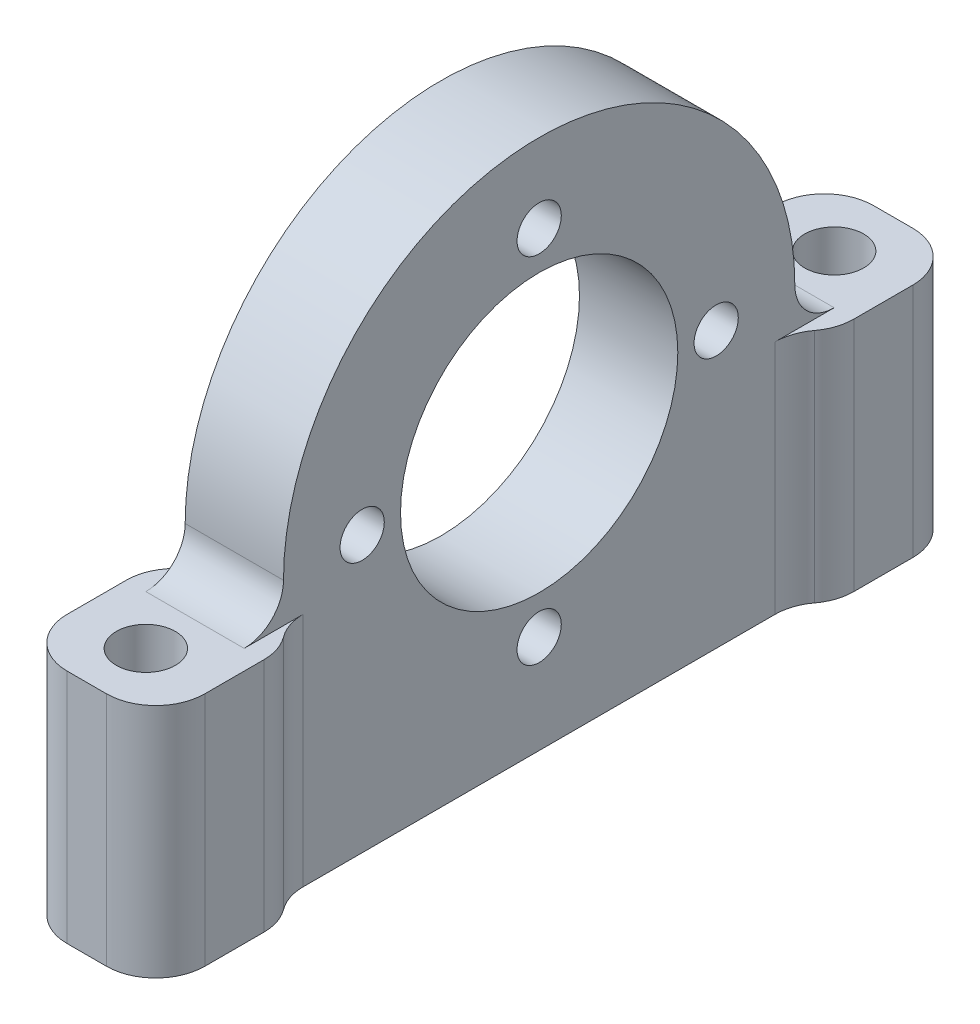
ISO-10303-21;
HEADER;
FILE_DESCRIPTION(('STEP AP214'),'2;1');
FILE_NAME('part.step','',(''),(''),'','','');
FILE_SCHEMA(('AUTOMOTIVE_DESIGN { 1 0 10303 214 1 1 1 1 }'));
ENDSEC;
DATA;
#1=APPLICATION_CONTEXT('core data for automotive mechanical design processes');
#2=APPLICATION_PROTOCOL_DEFINITION('international standard','automotive_design',2000,#1);
#3=PRODUCT_CONTEXT('',#1,'mechanical');
#4=PRODUCT('Part','Part','',(#3));
#5=PRODUCT_RELATED_PRODUCT_CATEGORY('part','',(#4));
#6=PRODUCT_DEFINITION_FORMATION('','',#4);
#7=PRODUCT_DEFINITION_CONTEXT('part definition',#1,'design');
#8=PRODUCT_DEFINITION('design','',#6,#7);
#9=PRODUCT_DEFINITION_SHAPE('','',#8);
#10=(LENGTH_UNIT() NAMED_UNIT(*) SI_UNIT(.MILLI.,.METRE.));
#11=(NAMED_UNIT(*) PLANE_ANGLE_UNIT() SI_UNIT($,.RADIAN.));
#12=(NAMED_UNIT(*) SI_UNIT($,.STERADIAN.) SOLID_ANGLE_UNIT());
#13=UNCERTAINTY_MEASURE_WITH_UNIT(LENGTH_MEASURE(1.E-05),#10,'distance_accuracy_value','');
#14=(GEOMETRIC_REPRESENTATION_CONTEXT(3) GLOBAL_UNCERTAINTY_ASSIGNED_CONTEXT((#13)) GLOBAL_UNIT_ASSIGNED_CONTEXT((#10,
#11,#12)) REPRESENTATION_CONTEXT('',''));
#15=CARTESIAN_POINT('',(0.,0.,0.));
#16=DIRECTION('',(0.,0.,1.));
#17=DIRECTION('',(1.,0.,0.));
#18=AXIS2_PLACEMENT_3D('',#15,#16,#17);
#19=CARTESIAN_POINT('',(-2.5,0.,0.));
#20=DIRECTION('',(1.,0.,0.));
#21=DIRECTION('',(0.,0.,-1.));
#22=AXIS2_PLACEMENT_3D('',#19,#20,#21);
#23=CYLINDRICAL_SURFACE('',#22,13.);
#24=DIRECTION('',(1.,0.,0.));
#25=VECTOR('',#24,1.);
#26=CARTESIAN_POINT('',(-2.5,0.,13.));
#27=LINE('',#26,#25);
#28=CARTESIAN_POINT('',(-2.5,0.,13.));
#29=VERTEX_POINT('',#28);
#30=CARTESIAN_POINT('',(2.5,0.,13.));
#31=VERTEX_POINT('',#30);
#32=EDGE_CURVE('E206',#29,#31,#27,.T.);
#33=ORIENTED_EDGE('',*,*,#32,.T.);
#34=CARTESIAN_POINT('',(2.5,0.,0.));
#35=DIRECTION('',(1.,0.,0.));
#36=DIRECTION('',(0.,0.,1.));
#37=AXIS2_PLACEMENT_3D('',#34,#35,#36);
#38=CIRCLE('',#37,13.);
#39=CARTESIAN_POINT('',(2.5,0.,-13.));
#40=VERTEX_POINT('',#39);
#41=EDGE_CURVE('E215',#40,#31,#38,.T.);
#42=ORIENTED_EDGE('',*,*,#41,.F.);
#43=DIRECTION('',(1.,0.,0.));
#44=VECTOR('',#43,1.);
#45=CARTESIAN_POINT('',(-2.5,0.,-13.));
#46=LINE('',#45,#44);
#47=CARTESIAN_POINT('',(-2.5,0.,-13.));
#48=VERTEX_POINT('',#47);
#49=EDGE_CURVE('E220',#48,#40,#46,.T.);
#50=ORIENTED_EDGE('',*,*,#49,.F.);
#51=CARTESIAN_POINT('',(-2.5,0.,0.));
#52=DIRECTION('',(1.,0.,0.));
#53=DIRECTION('',(0.,0.,1.));
#54=AXIS2_PLACEMENT_3D('',#51,#52,#53);
#55=CIRCLE('',#54,13.);
#56=EDGE_CURVE('E218',#48,#29,#55,.T.);
#57=ORIENTED_EDGE('',*,*,#56,.T.);
#58=EDGE_LOOP('',(#33,#42,#50,#57));
#59=FACE_BOUND('',#58,.T.);
#60=ADVANCED_FACE('F43',(#59),#23,.T.);
#61=CARTESIAN_POINT('',(-2.5,-14.,13.));
#62=DIRECTION('',(0.,-1.,0.));
#63=DIRECTION('',(0.,0.,-1.));
#64=AXIS2_PLACEMENT_3D('',#61,#62,#63);
#65=PLANE('',#64);
#66=CARTESIAN_POINT('',(0.,-14.,-17.5));
#67=DIRECTION('',(0.,-1.,0.));
#68=DIRECTION('',(0.,0.,-1.));
#69=AXIS2_PLACEMENT_3D('',#66,#67,#68);
#70=CIRCLE('',#69,1.5);
#71=CARTESIAN_POINT('',(0.,-14.,-19.));
#72=VERTEX_POINT('',#71);
#73=EDGE_CURVE('E440',#72,#72,#70,.T.);
#74=ORIENTED_EDGE('',*,*,#73,.F.);
#75=EDGE_LOOP('',(#74));
#76=FACE_BOUND('',#75,.T.);
#77=CARTESIAN_POINT('',(0.,-14.,17.5));
#78=DIRECTION('',(0.,1.,0.));
#79=DIRECTION('',(0.,0.,1.));
#80=AXIS2_PLACEMENT_3D('',#77,#78,#79);
#81=CIRCLE('',#80,1.5);
#82=CARTESIAN_POINT('',(0.,-14.,19.));
#83=VERTEX_POINT('',#82);
#84=EDGE_CURVE('E352',#83,#83,#81,.T.);
#85=ORIENTED_EDGE('',*,*,#84,.T.);
#86=EDGE_LOOP('',(#85));
#87=FACE_BOUND('',#86,.T.);
#88=DIRECTION('',(0.,0.,-1.));
#89=VECTOR('',#88,1.);
#90=CARTESIAN_POINT('',(-2.5,-14.,13.));
#91=LINE('',#90,#89);
#92=CARTESIAN_POINT('',(-2.5,-14.,12.));
#93=VERTEX_POINT('',#92);
#94=CARTESIAN_POINT('',(-2.5,-14.,-12.));
#95=VERTEX_POINT('',#94);
#96=EDGE_CURVE('E221',#93,#95,#91,.T.);
#97=ORIENTED_EDGE('',*,*,#96,.T.);
#98=CARTESIAN_POINT('',(-5.,-14.,-12.));
#99=DIRECTION('',(0.,-1.,0.));
#100=DIRECTION('',(0.,0.,-1.));
#101=AXIS2_PLACEMENT_3D('',#98,#99,#100);
#102=CIRCLE('',#101,2.5);
#103=CARTESIAN_POINT('',(-3.,-14.,-13.5));
#104=VERTEX_POINT('',#103);
#105=EDGE_CURVE('E425',#95,#104,#102,.F.);
#106=ORIENTED_EDGE('',*,*,#105,.T.);
#107=CARTESIAN_POINT('',(-1.,-14.,-15.));
#108=DIRECTION('',(0.,-1.,0.));
#109=DIRECTION('',(0.,0.,-1.));
#110=AXIS2_PLACEMENT_3D('',#107,#108,#109);
#111=CIRCLE('',#110,2.5);
#112=CARTESIAN_POINT('',(-3.5,-14.,-15.));
#113=VERTEX_POINT('',#112);
#114=EDGE_CURVE('E395',#104,#113,#111,.T.);
#115=ORIENTED_EDGE('',*,*,#114,.T.);
#116=DIRECTION('',(0.,0.,1.));
#117=VECTOR('',#116,1.);
#118=CARTESIAN_POINT('',(-3.5,-14.,-13.));
#119=LINE('',#118,#117);
#120=CARTESIAN_POINT('',(-3.5,-14.,-18.));
#121=VERTEX_POINT('',#120);
#122=EDGE_CURVE('E472',#121,#113,#119,.T.);
#123=ORIENTED_EDGE('',*,*,#122,.F.);
#124=CARTESIAN_POINT('',(-1.,-14.,-18.));
#125=DIRECTION('',(0.,-1.,0.));
#126=DIRECTION('',(0.,0.,-1.));
#127=AXIS2_PLACEMENT_3D('',#124,#125,#126);
#128=CIRCLE('',#127,2.5);
#129=CARTESIAN_POINT('',(-1.,-14.,-20.5));
#130=VERTEX_POINT('',#129);
#131=EDGE_CURVE('E359',#121,#130,#128,.T.);
#132=ORIENTED_EDGE('',*,*,#131,.T.);
#133=DIRECTION('',(1.,0.,0.));
#134=VECTOR('',#133,1.);
#135=CARTESIAN_POINT('',(-3.5,-14.,-20.5));
#136=LINE('',#135,#134);
#137=CARTESIAN_POINT('',(1.,-14.,-20.5));
#138=VERTEX_POINT('',#137);
#139=EDGE_CURVE('E482',#130,#138,#136,.T.);
#140=ORIENTED_EDGE('',*,*,#139,.T.);
#141=CARTESIAN_POINT('',(1.,-14.,-18.));
#142=DIRECTION('',(0.,-1.,0.));
#143=DIRECTION('',(0.,0.,-1.));
#144=AXIS2_PLACEMENT_3D('',#141,#142,#143);
#145=CIRCLE('',#144,2.5);
#146=CARTESIAN_POINT('',(3.5,-14.,-18.));
#147=VERTEX_POINT('',#146);
#148=EDGE_CURVE('E356',#138,#147,#145,.T.);
#149=ORIENTED_EDGE('',*,*,#148,.T.);
#150=DIRECTION('',(0.,0.,1.));
#151=VECTOR('',#150,1.);
#152=CARTESIAN_POINT('',(3.5,-14.,-13.));
#153=LINE('',#152,#151);
#154=CARTESIAN_POINT('',(3.5,-14.,-15.));
#155=VERTEX_POINT('',#154);
#156=EDGE_CURVE('E439',#147,#155,#153,.T.);
#157=ORIENTED_EDGE('',*,*,#156,.T.);
#158=CARTESIAN_POINT('',(1.,-14.,-15.));
#159=DIRECTION('',(0.,-1.,0.));
#160=DIRECTION('',(0.,0.,-1.));
#161=AXIS2_PLACEMENT_3D('',#158,#159,#160);
#162=CIRCLE('',#161,2.5);
#163=CARTESIAN_POINT('',(3.,-14.,-13.5));
#164=VERTEX_POINT('',#163);
#165=EDGE_CURVE('E391',#155,#164,#162,.T.);
#166=ORIENTED_EDGE('',*,*,#165,.T.);
#167=CARTESIAN_POINT('',(5.,-14.,-12.));
#168=DIRECTION('',(0.,-1.,0.));
#169=DIRECTION('',(0.,0.,-1.));
#170=AXIS2_PLACEMENT_3D('',#167,#168,#169);
#171=CIRCLE('',#170,2.5);
#172=CARTESIAN_POINT('',(2.5,-14.,-12.));
#173=VERTEX_POINT('',#172);
#174=EDGE_CURVE('E431',#164,#173,#171,.F.);
#175=ORIENTED_EDGE('',*,*,#174,.T.);
#176=DIRECTION('',(0.,0.,-1.));
#177=VECTOR('',#176,1.);
#178=CARTESIAN_POINT('',(2.5,-14.,13.));
#179=LINE('',#178,#177);
#180=CARTESIAN_POINT('',(2.5,-14.,12.));
#181=VERTEX_POINT('',#180);
#182=EDGE_CURVE('E229',#181,#173,#179,.T.);
#183=ORIENTED_EDGE('',*,*,#182,.F.);
#184=CARTESIAN_POINT('',(5.,-14.,12.));
#185=DIRECTION('',(0.,-1.,0.));
#186=DIRECTION('',(0.,0.,-1.));
#187=AXIS2_PLACEMENT_3D('',#184,#185,#186);
#188=CIRCLE('',#187,2.5);
#189=CARTESIAN_POINT('',(3.,-14.,13.5));
#190=VERTEX_POINT('',#189);
#191=EDGE_CURVE('E340',#181,#190,#188,.F.);
#192=ORIENTED_EDGE('',*,*,#191,.T.);
#193=CARTESIAN_POINT('',(1.,-14.,15.));
#194=DIRECTION('',(0.,-1.,0.));
#195=DIRECTION('',(0.,0.,-1.));
#196=AXIS2_PLACEMENT_3D('',#193,#194,#195);
#197=CIRCLE('',#196,2.5);
#198=CARTESIAN_POINT('',(3.5,-14.,15.));
#199=VERTEX_POINT('',#198);
#200=EDGE_CURVE('E305',#190,#199,#197,.T.);
#201=ORIENTED_EDGE('',*,*,#200,.T.);
#202=DIRECTION('',(0.,0.,-1.));
#203=VECTOR('',#202,1.);
#204=CARTESIAN_POINT('',(3.5,-14.,13.));
#205=LINE('',#204,#203);
#206=CARTESIAN_POINT('',(3.5,-14.,18.));
#207=VERTEX_POINT('',#206);
#208=EDGE_CURVE('E499',#207,#199,#205,.T.);
#209=ORIENTED_EDGE('',*,*,#208,.F.);
#210=CARTESIAN_POINT('',(1.,-14.,18.));
#211=DIRECTION('',(0.,-1.,0.));
#212=DIRECTION('',(0.,0.,-1.));
#213=AXIS2_PLACEMENT_3D('',#210,#211,#212);
#214=CIRCLE('',#213,2.5);
#215=CARTESIAN_POINT('',(1.,-14.,20.5));
#216=VERTEX_POINT('',#215);
#217=EDGE_CURVE('E274',#207,#216,#214,.T.);
#218=ORIENTED_EDGE('',*,*,#217,.T.);
#219=DIRECTION('',(1.,0.,0.));
#220=VECTOR('',#219,1.);
#221=CARTESIAN_POINT('',(-3.5,-14.,20.5));
#222=LINE('',#221,#220);
#223=CARTESIAN_POINT('',(-1.,-14.,20.5));
#224=VERTEX_POINT('',#223);
#225=EDGE_CURVE('E511',#224,#216,#222,.T.);
#226=ORIENTED_EDGE('',*,*,#225,.F.);
#227=CARTESIAN_POINT('',(-1.,-14.,18.));
#228=DIRECTION('',(0.,-1.,0.));
#229=DIRECTION('',(0.,0.,-1.));
#230=AXIS2_PLACEMENT_3D('',#227,#228,#229);
#231=CIRCLE('',#230,2.5);
#232=CARTESIAN_POINT('',(-3.5,-14.,18.));
#233=VERTEX_POINT('',#232);
#234=EDGE_CURVE('E277',#224,#233,#231,.T.);
#235=ORIENTED_EDGE('',*,*,#234,.T.);
#236=DIRECTION('',(0.,0.,-1.));
#237=VECTOR('',#236,1.);
#238=CARTESIAN_POINT('',(-3.5,-14.,13.));
#239=LINE('',#238,#237);
#240=CARTESIAN_POINT('',(-3.5,-14.,15.));
#241=VERTEX_POINT('',#240);
#242=EDGE_CURVE('E506',#233,#241,#239,.T.);
#243=ORIENTED_EDGE('',*,*,#242,.T.);
#244=CARTESIAN_POINT('',(-1.,-14.,15.));
#245=DIRECTION('',(0.,-1.,0.));
#246=DIRECTION('',(0.,0.,-1.));
#247=AXIS2_PLACEMENT_3D('',#244,#245,#246);
#248=CIRCLE('',#247,2.5);
#249=CARTESIAN_POINT('',(-3.,-14.,13.5));
#250=VERTEX_POINT('',#249);
#251=EDGE_CURVE('E308',#241,#250,#248,.T.);
#252=ORIENTED_EDGE('',*,*,#251,.T.);
#253=CARTESIAN_POINT('',(-5.,-14.,12.));
#254=DIRECTION('',(0.,-1.,0.));
#255=DIRECTION('',(0.,0.,-1.));
#256=AXIS2_PLACEMENT_3D('',#253,#254,#255);
#257=CIRCLE('',#256,2.5);
#258=EDGE_CURVE('E334',#250,#93,#257,.F.);
#259=ORIENTED_EDGE('',*,*,#258,.T.);
#260=EDGE_LOOP('',(#97,#106,#115,#123,#132,#140,#149,#157,#166,#175,#183,#192,#201,#209,#218,
#226,#235,#243,#252,#259));
#261=FACE_BOUND('',#260,.T.);
#262=ADVANCED_FACE('F471',(#76,#87,#261),#65,.T.);
#263=CARTESIAN_POINT('',(-2.5,0.,0.));
#264=DIRECTION('',(-1.,0.,0.));
#265=DIRECTION('',(0.,0.,1.));
#266=AXIS2_PLACEMENT_3D('',#263,#264,#265);
#267=PLANE('',#266);
#268=CARTESIAN_POINT('',(-2.5,0.,0.));
#269=DIRECTION('',(1.,0.,0.));
#270=DIRECTION('',(0.,0.,-1.));
#271=AXIS2_PLACEMENT_3D('',#268,#269,#270);
#272=CIRCLE('',#271,7.05);
#273=CARTESIAN_POINT('',(-2.5,0.,-7.05));
#274=VERTEX_POINT('',#273);
#275=EDGE_CURVE('E234',#274,#274,#272,.T.);
#276=ORIENTED_EDGE('',*,*,#275,.T.);
#277=EDGE_LOOP('',(#276));
#278=FACE_BOUND('',#277,.T.);
#279=CARTESIAN_POINT('',(-2.5,0.,9.));
#280=DIRECTION('',(1.,0.,0.));
#281=DIRECTION('',(0.,0.,-1.));
#282=AXIS2_PLACEMENT_3D('',#279,#280,#281);
#283=CIRCLE('',#282,1.125);
#284=CARTESIAN_POINT('',(-2.5,0.,7.875));
#285=VERTEX_POINT('',#284);
#286=EDGE_CURVE('E244',#285,#285,#283,.T.);
#287=ORIENTED_EDGE('',*,*,#286,.T.);
#288=EDGE_LOOP('',(#287));
#289=FACE_BOUND('',#288,.T.);
#290=CARTESIAN_POINT('',(-2.5,-9.,0.));
#291=DIRECTION('',(1.,0.,0.));
#292=DIRECTION('',(0.,0.,-1.));
#293=AXIS2_PLACEMENT_3D('',#290,#291,#292);
#294=CIRCLE('',#293,1.125);
#295=CARTESIAN_POINT('',(-2.5,-9.,-1.125));
#296=VERTEX_POINT('',#295);
#297=EDGE_CURVE('E248',#296,#296,#294,.T.);
#298=ORIENTED_EDGE('',*,*,#297,.T.);
#299=EDGE_LOOP('',(#298));
#300=FACE_BOUND('',#299,.T.);
#301=CARTESIAN_POINT('',(-2.5,0.,-9.));
#302=DIRECTION('',(1.,0.,0.));
#303=DIRECTION('',(0.,0.,-1.));
#304=AXIS2_PLACEMENT_3D('',#301,#302,#303);
#305=CIRCLE('',#304,1.125);
#306=CARTESIAN_POINT('',(-2.5,0.,-10.125));
#307=VERTEX_POINT('',#306);
#308=EDGE_CURVE('E252',#307,#307,#305,.T.);
#309=ORIENTED_EDGE('',*,*,#308,.T.);
#310=EDGE_LOOP('',(#309));
#311=FACE_BOUND('',#310,.T.);
#312=CARTESIAN_POINT('',(-2.5,9.,0.));
#313=DIRECTION('',(1.,0.,0.));
#314=DIRECTION('',(0.,0.,-1.));
#315=AXIS2_PLACEMENT_3D('',#312,#313,#314);
#316=CIRCLE('',#315,1.125);
#317=CARTESIAN_POINT('',(-2.5,9.,-1.125));
#318=VERTEX_POINT('',#317);
#319=EDGE_CURVE('E256',#318,#318,#316,.T.);
#320=ORIENTED_EDGE('',*,*,#319,.T.);
#321=EDGE_LOOP('',(#320));
#322=FACE_BOUND('',#321,.T.);
#323=ORIENTED_EDGE('',*,*,#56,.F.);
#324=CARTESIAN_POINT('',(-2.5,0.,-15.));
#325=DIRECTION('',(-1.,0.,0.));
#326=DIRECTION('',(0.,0.,1.));
#327=AXIS2_PLACEMENT_3D('',#324,#325,#326);
#328=CIRCLE('',#327,2.);
#329=CARTESIAN_POINT('',(-2.5,-2.,-15.));
#330=VERTEX_POINT('',#329);
#331=EDGE_CURVE('E211',#48,#330,#328,.F.);
#332=ORIENTED_EDGE('',*,*,#331,.T.);
#333=DIRECTION('',(0.,0.,1.));
#334=VECTOR('',#333,1.);
#335=CARTESIAN_POINT('',(-2.5,-2.,0.));
#336=LINE('',#335,#334);
#337=CARTESIAN_POINT('',(-2.5,-2.,-12.));
#338=VERTEX_POINT('',#337);
#339=EDGE_CURVE('E408',#330,#338,#336,.T.);
#340=ORIENTED_EDGE('',*,*,#339,.T.);
#341=DIRECTION('',(0.,-1.,0.));
#342=VECTOR('',#341,1.);
#343=CARTESIAN_POINT('',(-2.5,-14.,-12.));
#344=LINE('',#343,#342);
#345=EDGE_CURVE('E405',#338,#95,#344,.T.);
#346=ORIENTED_EDGE('',*,*,#345,.T.);
#347=ORIENTED_EDGE('',*,*,#96,.F.);
#348=DIRECTION('',(0.,-1.,0.));
#349=VECTOR('',#348,1.);
#350=CARTESIAN_POINT('',(-2.5,-2.,12.));
#351=LINE('',#350,#349);
#352=CARTESIAN_POINT('',(-2.5,-2.,12.));
#353=VERTEX_POINT('',#352);
#354=EDGE_CURVE('E322',#93,#353,#351,.F.);
#355=ORIENTED_EDGE('',*,*,#354,.T.);
#356=DIRECTION('',(0.,0.,1.));
#357=VECTOR('',#356,1.);
#358=CARTESIAN_POINT('',(-2.5,-2.,13.));
#359=LINE('',#358,#357);
#360=CARTESIAN_POINT('',(-2.5,-2.,15.));
#361=VERTEX_POINT('',#360);
#362=EDGE_CURVE('E66',#353,#361,#359,.T.);
#363=ORIENTED_EDGE('',*,*,#362,.T.);
#364=CARTESIAN_POINT('',(-2.5,0.,15.));
#365=DIRECTION('',(-1.,0.,0.));
#366=DIRECTION('',(0.,0.,1.));
#367=AXIS2_PLACEMENT_3D('',#364,#365,#366);
#368=CIRCLE('',#367,2.);
#369=EDGE_CURVE('E11',#361,#29,#368,.F.);
#370=ORIENTED_EDGE('',*,*,#369,.T.);
#371=EDGE_LOOP('',(#323,#332,#340,#346,#347,#355,#363,#370));
#372=FACE_BOUND('',#371,.T.);
#373=ADVANCED_FACE('F452',(#278,#289,#300,#311,#322,#372),#267,.T.);
#374=CARTESIAN_POINT('',(-2.5,9.,0.));
#375=DIRECTION('',(1.,0.,0.));
#376=DIRECTION('',(0.,0.,-1.));
#377=AXIS2_PLACEMENT_3D('',#374,#375,#376);
#378=CYLINDRICAL_SURFACE('',#377,1.125);
#379=ORIENTED_EDGE('',*,*,#319,.F.);
#380=EDGE_LOOP('',(#379));
#381=FACE_BOUND('',#380,.T.);
#382=CARTESIAN_POINT('',(2.5,9.,0.));
#383=DIRECTION('',(1.,0.,0.));
#384=DIRECTION('',(0.,0.,-1.));
#385=AXIS2_PLACEMENT_3D('',#382,#383,#384);
#386=CIRCLE('',#385,1.125);
#387=CARTESIAN_POINT('',(2.5,9.,-1.125));
#388=VERTEX_POINT('',#387);
#389=EDGE_CURVE('E230',#388,#388,#386,.T.);
#390=ORIENTED_EDGE('',*,*,#389,.T.);
#391=EDGE_LOOP('',(#390));
#392=FACE_BOUND('',#391,.T.);
#393=ADVANCED_FACE('F760',(#381,#392),#378,.F.);
#394=CARTESIAN_POINT('',(-2.5,0.,-9.));
#395=DIRECTION('',(1.,0.,0.));
#396=DIRECTION('',(0.,0.,-1.));
#397=AXIS2_PLACEMENT_3D('',#394,#395,#396);
#398=CYLINDRICAL_SURFACE('',#397,1.125);
#399=ORIENTED_EDGE('',*,*,#308,.F.);
#400=EDGE_LOOP('',(#399));
#401=FACE_BOUND('',#400,.T.);
#402=CARTESIAN_POINT('',(2.5,0.,-9.));
#403=DIRECTION('',(1.,0.,0.));
#404=DIRECTION('',(0.,0.,-1.));
#405=AXIS2_PLACEMENT_3D('',#402,#403,#404);
#406=CIRCLE('',#405,1.125);
#407=CARTESIAN_POINT('',(2.5,0.,-10.125));
#408=VERTEX_POINT('',#407);
#409=EDGE_CURVE('E237',#408,#408,#406,.T.);
#410=ORIENTED_EDGE('',*,*,#409,.T.);
#411=EDGE_LOOP('',(#410));
#412=FACE_BOUND('',#411,.T.);
#413=ADVANCED_FACE('F533',(#401,#412),#398,.F.);
#414=CARTESIAN_POINT('',(-2.5,-9.,0.));
#415=DIRECTION('',(1.,0.,0.));
#416=DIRECTION('',(0.,0.,-1.));
#417=AXIS2_PLACEMENT_3D('',#414,#415,#416);
#418=CYLINDRICAL_SURFACE('',#417,1.125);
#419=ORIENTED_EDGE('',*,*,#297,.F.);
#420=EDGE_LOOP('',(#419));
#421=FACE_BOUND('',#420,.T.);
#422=CARTESIAN_POINT('',(2.5,-9.,0.));
#423=DIRECTION('',(1.,0.,0.));
#424=DIRECTION('',(0.,0.,-1.));
#425=AXIS2_PLACEMENT_3D('',#422,#423,#424);
#426=CIRCLE('',#425,1.125);
#427=CARTESIAN_POINT('',(2.5,-9.,-1.125));
#428=VERTEX_POINT('',#427);
#429=EDGE_CURVE('E526',#428,#428,#426,.T.);
#430=ORIENTED_EDGE('',*,*,#429,.T.);
#431=EDGE_LOOP('',(#430));
#432=FACE_BOUND('',#431,.T.);
#433=ADVANCED_FACE('F553',(#421,#432),#418,.F.);
#434=CARTESIAN_POINT('',(-2.5,0.,9.));
#435=DIRECTION('',(1.,0.,0.));
#436=DIRECTION('',(0.,0.,-1.));
#437=AXIS2_PLACEMENT_3D('',#434,#435,#436);
#438=CYLINDRICAL_SURFACE('',#437,1.125);
#439=ORIENTED_EDGE('',*,*,#286,.F.);
#440=EDGE_LOOP('',(#439));
#441=FACE_BOUND('',#440,.T.);
#442=CARTESIAN_POINT('',(2.5,0.,9.));
#443=DIRECTION('',(1.,0.,0.));
#444=DIRECTION('',(0.,0.,-1.));
#445=AXIS2_PLACEMENT_3D('',#442,#443,#444);
#446=CIRCLE('',#445,1.125);
#447=CARTESIAN_POINT('',(2.5,0.,7.875));
#448=VERTEX_POINT('',#447);
#449=EDGE_CURVE('E522',#448,#448,#446,.T.);
#450=ORIENTED_EDGE('',*,*,#449,.T.);
#451=EDGE_LOOP('',(#450));
#452=FACE_BOUND('',#451,.T.);
#453=ADVANCED_FACE('F547',(#441,#452),#438,.F.);
#454=CARTESIAN_POINT('',(-2.5,0.,0.));
#455=DIRECTION('',(1.,0.,0.));
#456=DIRECTION('',(0.,0.,-1.));
#457=AXIS2_PLACEMENT_3D('',#454,#455,#456);
#458=CYLINDRICAL_SURFACE('',#457,7.05);
#459=ORIENTED_EDGE('',*,*,#275,.F.);
#460=EDGE_LOOP('',(#459));
#461=FACE_BOUND('',#460,.T.);
#462=CARTESIAN_POINT('',(2.5,0.,0.));
#463=DIRECTION('',(1.,0.,0.));
#464=DIRECTION('',(0.,0.,-1.));
#465=AXIS2_PLACEMENT_3D('',#462,#463,#464);
#466=CIRCLE('',#465,7.05);
#467=CARTESIAN_POINT('',(2.5,0.,-7.05));
#468=VERTEX_POINT('',#467);
#469=EDGE_CURVE('E515',#468,#468,#466,.T.);
#470=ORIENTED_EDGE('',*,*,#469,.T.);
#471=EDGE_LOOP('',(#470));
#472=FACE_BOUND('',#471,.T.);
#473=ADVANCED_FACE('F538',(#461,#472),#458,.F.);
#474=CARTESIAN_POINT('',(2.5,0.,0.));
#475=DIRECTION('',(-1.,0.,0.));
#476=DIRECTION('',(0.,0.,1.));
#477=AXIS2_PLACEMENT_3D('',#474,#475,#476);
#478=PLANE('',#477);
#479=ORIENTED_EDGE('',*,*,#182,.T.);
#480=DIRECTION('',(0.,1.,0.));
#481=VECTOR('',#480,1.);
#482=CARTESIAN_POINT('',(2.5,0.,-12.));
#483=LINE('',#482,#481);
#484=CARTESIAN_POINT('',(2.5,-2.,-12.));
#485=VERTEX_POINT('',#484);
#486=EDGE_CURVE('E415',#173,#485,#483,.T.);
#487=ORIENTED_EDGE('',*,*,#486,.T.);
#488=DIRECTION('',(0.,0.,-1.));
#489=VECTOR('',#488,1.);
#490=CARTESIAN_POINT('',(2.5,-2.,-13.));
#491=LINE('',#490,#489);
#492=CARTESIAN_POINT('',(2.5,-2.,-15.));
#493=VERTEX_POINT('',#492);
#494=EDGE_CURVE('E412',#485,#493,#491,.T.);
#495=ORIENTED_EDGE('',*,*,#494,.T.);
#496=CARTESIAN_POINT('',(2.5,0.,-15.));
#497=DIRECTION('',(-1.,0.,0.));
#498=DIRECTION('',(0.,0.,1.));
#499=AXIS2_PLACEMENT_3D('',#496,#497,#498);
#500=CIRCLE('',#499,2.);
#501=EDGE_CURVE('E227',#493,#40,#500,.T.);
#502=ORIENTED_EDGE('',*,*,#501,.T.);
#503=ORIENTED_EDGE('',*,*,#41,.T.);
#504=CARTESIAN_POINT('',(2.5,0.,15.));
#505=DIRECTION('',(-1.,0.,0.));
#506=DIRECTION('',(0.,0.,1.));
#507=AXIS2_PLACEMENT_3D('',#504,#505,#506);
#508=CIRCLE('',#507,2.);
#509=CARTESIAN_POINT('',(2.5,-2.,15.));
#510=VERTEX_POINT('',#509);
#511=EDGE_CURVE('E52',#31,#510,#508,.T.);
#512=ORIENTED_EDGE('',*,*,#511,.T.);
#513=DIRECTION('',(0.,0.,-1.));
#514=VECTOR('',#513,1.);
#515=CARTESIAN_POINT('',(2.5,-2.,0.));
#516=LINE('',#515,#514);
#517=CARTESIAN_POINT('',(2.5,-2.,12.));
#518=VERTEX_POINT('',#517);
#519=EDGE_CURVE('E59',#510,#518,#516,.T.);
#520=ORIENTED_EDGE('',*,*,#519,.T.);
#521=DIRECTION('',(0.,1.,0.));
#522=VECTOR('',#521,1.);
#523=CARTESIAN_POINT('',(2.5,0.,12.));
#524=LINE('',#523,#522);
#525=EDGE_CURVE('E327',#518,#181,#524,.F.);
#526=ORIENTED_EDGE('',*,*,#525,.T.);
#527=EDGE_LOOP('',(#479,#487,#495,#502,#503,#512,#520,#526));
#528=FACE_BOUND('',#527,.T.);
#529=ORIENTED_EDGE('',*,*,#389,.F.);
#530=EDGE_LOOP('',(#529));
#531=FACE_BOUND('',#530,.T.);
#532=ORIENTED_EDGE('',*,*,#409,.F.);
#533=EDGE_LOOP('',(#532));
#534=FACE_BOUND('',#533,.T.);
#535=ORIENTED_EDGE('',*,*,#429,.F.);
#536=EDGE_LOOP('',(#535));
#537=FACE_BOUND('',#536,.T.);
#538=ORIENTED_EDGE('',*,*,#449,.F.);
#539=EDGE_LOOP('',(#538));
#540=FACE_BOUND('',#539,.T.);
#541=ORIENTED_EDGE('',*,*,#469,.F.);
#542=EDGE_LOOP('',(#541));
#543=FACE_BOUND('',#542,.T.);
#544=ADVANCED_FACE('F224',(#528,#531,#534,#537,#540,#543),#478,.F.);
#545=CARTESIAN_POINT('',(-3.5,-14.,20.5));
#546=DIRECTION('',(0.,0.,1.));
#547=DIRECTION('',(1.,0.,0.));
#548=AXIS2_PLACEMENT_3D('',#545,#546,#547);
#549=PLANE('',#548);
#550=DIRECTION('',(1.,0.,0.));
#551=VECTOR('',#550,1.);
#552=CARTESIAN_POINT('',(-3.5,-2.,20.5));
#553=LINE('',#552,#551);
#554=CARTESIAN_POINT('',(-1.,-2.,20.5));
#555=VERTEX_POINT('',#554);
#556=CARTESIAN_POINT('',(1.,-2.,20.5));
#557=VERTEX_POINT('',#556);
#558=EDGE_CURVE('E510',#555,#557,#553,.T.);
#559=ORIENTED_EDGE('',*,*,#558,.F.);
#560=DIRECTION('',(0.,-1.,0.));
#561=VECTOR('',#560,1.);
#562=CARTESIAN_POINT('',(-1.,-14.,20.5));
#563=LINE('',#562,#561);
#564=EDGE_CURVE('E270',#555,#224,#563,.T.);
#565=ORIENTED_EDGE('',*,*,#564,.T.);
#566=ORIENTED_EDGE('',*,*,#225,.T.);
#567=DIRECTION('',(0.,-1.,0.));
#568=VECTOR('',#567,1.);
#569=CARTESIAN_POINT('',(1.,-14.,20.5));
#570=LINE('',#569,#568);
#571=EDGE_CURVE('E266',#216,#557,#570,.F.);
#572=ORIENTED_EDGE('',*,*,#571,.T.);
#573=EDGE_LOOP('',(#559,#565,#566,#572));
#574=FACE_BOUND('',#573,.T.);
#575=ADVANCED_FACE('F537',(#574),#549,.T.);
#576=CARTESIAN_POINT('',(-3.5,-2.,13.));
#577=DIRECTION('',(0.,1.,0.));
#578=DIRECTION('',(0.,0.,1.));
#579=AXIS2_PLACEMENT_3D('',#576,#577,#578);
#580=PLANE('',#579);
#581=CARTESIAN_POINT('',(0.,-2.,17.5));
#582=DIRECTION('',(0.,1.,0.));
#583=DIRECTION('',(0.,0.,1.));
#584=AXIS2_PLACEMENT_3D('',#581,#582,#583);
#585=CIRCLE('',#584,1.5);
#586=CARTESIAN_POINT('',(0.,-2.,19.));
#587=VERTEX_POINT('',#586);
#588=EDGE_CURVE('E347',#587,#587,#585,.T.);
#589=ORIENTED_EDGE('',*,*,#588,.F.);
#590=EDGE_LOOP('',(#589));
#591=FACE_BOUND('',#590,.T.);
#592=ORIENTED_EDGE('',*,*,#519,.F.);
#593=DIRECTION('',(1.,0.,0.));
#594=VECTOR('',#593,1.);
#595=CARTESIAN_POINT('',(-2.5,-2.,15.));
#596=LINE('',#595,#594);
#597=EDGE_CURVE('E207',#510,#361,#596,.F.);
#598=ORIENTED_EDGE('',*,*,#597,.T.);
#599=ORIENTED_EDGE('',*,*,#362,.F.);
#600=CARTESIAN_POINT('',(-5.,-2.,12.));
#601=DIRECTION('',(0.,1.,0.));
#602=DIRECTION('',(0.,0.,1.));
#603=AXIS2_PLACEMENT_3D('',#600,#601,#602);
#604=CIRCLE('',#603,2.5);
#605=CARTESIAN_POINT('',(-3.,-2.,13.5));
#606=VERTEX_POINT('',#605);
#607=EDGE_CURVE('E337',#353,#606,#604,.F.);
#608=ORIENTED_EDGE('',*,*,#607,.T.);
#609=CARTESIAN_POINT('',(-1.,-2.,15.));
#610=DIRECTION('',(0.,1.,0.));
#611=DIRECTION('',(0.,0.,1.));
#612=AXIS2_PLACEMENT_3D('',#609,#610,#611);
#613=CIRCLE('',#612,2.5);
#614=CARTESIAN_POINT('',(-3.5,-2.,15.));
#615=VERTEX_POINT('',#614);
#616=EDGE_CURVE('E299',#606,#615,#613,.T.);
#617=ORIENTED_EDGE('',*,*,#616,.T.);
#618=DIRECTION('',(0.,0.,1.));
#619=VECTOR('',#618,1.);
#620=CARTESIAN_POINT('',(-3.5,-2.,13.));
#621=LINE('',#620,#619);
#622=CARTESIAN_POINT('',(-3.5,-2.,18.));
#623=VERTEX_POINT('',#622);
#624=EDGE_CURVE('E503',#615,#623,#621,.T.);
#625=ORIENTED_EDGE('',*,*,#624,.T.);
#626=CARTESIAN_POINT('',(-1.,-2.,18.));
#627=DIRECTION('',(0.,1.,0.));
#628=DIRECTION('',(0.,0.,1.));
#629=AXIS2_PLACEMENT_3D('',#626,#627,#628);
#630=CIRCLE('',#629,2.5);
#631=EDGE_CURVE('E288',#623,#555,#630,.T.);
#632=ORIENTED_EDGE('',*,*,#631,.T.);
#633=ORIENTED_EDGE('',*,*,#558,.T.);
#634=CARTESIAN_POINT('',(1.,-2.,18.));
#635=DIRECTION('',(0.,1.,0.));
#636=DIRECTION('',(0.,0.,1.));
#637=AXIS2_PLACEMENT_3D('',#634,#635,#636);
#638=CIRCLE('',#637,2.5);
#639=CARTESIAN_POINT('',(3.5,-2.,18.));
#640=VERTEX_POINT('',#639);
#641=EDGE_CURVE('E284',#557,#640,#638,.T.);
#642=ORIENTED_EDGE('',*,*,#641,.T.);
#643=DIRECTION('',(0.,0.,1.));
#644=VECTOR('',#643,1.);
#645=CARTESIAN_POINT('',(3.5,-2.,13.));
#646=LINE('',#645,#644);
#647=CARTESIAN_POINT('',(3.5,-2.,15.));
#648=VERTEX_POINT('',#647);
#649=EDGE_CURVE('E351',#648,#640,#646,.T.);
#650=ORIENTED_EDGE('',*,*,#649,.F.);
#651=CARTESIAN_POINT('',(1.,-2.,15.));
#652=DIRECTION('',(0.,1.,0.));
#653=DIRECTION('',(0.,0.,1.));
#654=AXIS2_PLACEMENT_3D('',#651,#652,#653);
#655=CIRCLE('',#654,2.5);
#656=CARTESIAN_POINT('',(3.,-2.,13.5));
#657=VERTEX_POINT('',#656);
#658=EDGE_CURVE('E295',#648,#657,#655,.T.);
#659=ORIENTED_EDGE('',*,*,#658,.T.);
#660=CARTESIAN_POINT('',(5.,-2.,12.));
#661=DIRECTION('',(0.,1.,0.));
#662=DIRECTION('',(0.,0.,1.));
#663=AXIS2_PLACEMENT_3D('',#660,#661,#662);
#664=CIRCLE('',#663,2.5);
#665=EDGE_CURVE('E343',#657,#518,#664,.F.);
#666=ORIENTED_EDGE('',*,*,#665,.T.);
#667=EDGE_LOOP('',(#592,#598,#599,#608,#617,#625,#632,#633,#642,#650,#659,#666));
#668=FACE_BOUND('',#667,.T.);
#669=ADVANCED_FACE('F646',(#591,#668),#580,.T.);
#670=CARTESIAN_POINT('',(-3.5,0.,0.));
#671=DIRECTION('',(1.,0.,0.));
#672=DIRECTION('',(0.,0.,-1.));
#673=AXIS2_PLACEMENT_3D('',#670,#671,#672);
#674=PLANE('',#673);
#675=ORIENTED_EDGE('',*,*,#624,.F.);
#676=DIRECTION('',(0.,1.,0.));
#677=VECTOR('',#676,1.);
#678=CARTESIAN_POINT('',(-3.5,0.,15.));
#679=LINE('',#678,#677);
#680=EDGE_CURVE('E302',#615,#241,#679,.F.);
#681=ORIENTED_EDGE('',*,*,#680,.T.);
#682=ORIENTED_EDGE('',*,*,#242,.F.);
#683=DIRECTION('',(0.,-1.,0.));
#684=VECTOR('',#683,1.);
#685=CARTESIAN_POINT('',(-3.5,-2.,18.));
#686=LINE('',#685,#684);
#687=EDGE_CURVE('E280',#233,#623,#686,.F.);
#688=ORIENTED_EDGE('',*,*,#687,.T.);
#689=EDGE_LOOP('',(#675,#681,#682,#688));
#690=FACE_BOUND('',#689,.T.);
#691=ADVANCED_FACE('F642',(#690),#674,.F.);
#692=CARTESIAN_POINT('',(3.5,0.,0.));
#693=DIRECTION('',(1.,0.,0.));
#694=DIRECTION('',(0.,0.,-1.));
#695=AXIS2_PLACEMENT_3D('',#692,#693,#694);
#696=PLANE('',#695);
#697=ORIENTED_EDGE('',*,*,#208,.T.);
#698=DIRECTION('',(0.,-1.,0.));
#699=VECTOR('',#698,1.);
#700=CARTESIAN_POINT('',(3.5,-2.,15.));
#701=LINE('',#700,#699);
#702=EDGE_CURVE('E312',#199,#648,#701,.F.);
#703=ORIENTED_EDGE('',*,*,#702,.T.);
#704=ORIENTED_EDGE('',*,*,#649,.T.);
#705=DIRECTION('',(0.,-1.,0.));
#706=VECTOR('',#705,1.);
#707=CARTESIAN_POINT('',(3.5,0.,18.));
#708=LINE('',#707,#706);
#709=EDGE_CURVE('E291',#640,#207,#708,.T.);
#710=ORIENTED_EDGE('',*,*,#709,.T.);
#711=EDGE_LOOP('',(#697,#703,#704,#710));
#712=FACE_BOUND('',#711,.T.);
#713=ADVANCED_FACE('F570',(#712),#696,.T.);
#714=CARTESIAN_POINT('',(-1.,-14.,18.));
#715=DIRECTION('',(0.,1.,0.));
#716=DIRECTION('',(0.,0.,1.));
#717=AXIS2_PLACEMENT_3D('',#714,#715,#716);
#718=CYLINDRICAL_SURFACE('',#717,2.5);
#719=ORIENTED_EDGE('',*,*,#631,.F.);
#720=ORIENTED_EDGE('',*,*,#687,.F.);
#721=ORIENTED_EDGE('',*,*,#234,.F.);
#722=ORIENTED_EDGE('',*,*,#564,.F.);
#723=EDGE_LOOP('',(#719,#720,#721,#722));
#724=FACE_BOUND('',#723,.T.);
#725=ADVANCED_FACE('F566',(#724),#718,.T.);
#726=CARTESIAN_POINT('',(1.,0.,18.));
#727=DIRECTION('',(0.,-1.,0.));
#728=DIRECTION('',(0.,0.,-1.));
#729=AXIS2_PLACEMENT_3D('',#726,#727,#728);
#730=CYLINDRICAL_SURFACE('',#729,2.5);
#731=ORIENTED_EDGE('',*,*,#641,.F.);
#732=ORIENTED_EDGE('',*,*,#571,.F.);
#733=ORIENTED_EDGE('',*,*,#217,.F.);
#734=ORIENTED_EDGE('',*,*,#709,.F.);
#735=EDGE_LOOP('',(#731,#732,#733,#734));
#736=FACE_BOUND('',#735,.T.);
#737=ADVANCED_FACE('F569',(#736),#730,.T.);
#738=CARTESIAN_POINT('',(-1.,-14.,15.));
#739=DIRECTION('',(0.,1.,0.));
#740=DIRECTION('',(0.,0.,1.));
#741=AXIS2_PLACEMENT_3D('',#738,#739,#740);
#742=CYLINDRICAL_SURFACE('',#741,2.5);
#743=ORIENTED_EDGE('',*,*,#616,.F.);
#744=DIRECTION('',(0.,1.,0.));
#745=VECTOR('',#744,1.);
#746=CARTESIAN_POINT('',(-3.,-14.,13.5));
#747=LINE('',#746,#745);
#748=EDGE_CURVE('E316',#606,#250,#747,.F.);
#749=ORIENTED_EDGE('',*,*,#748,.T.);
#750=ORIENTED_EDGE('',*,*,#251,.F.);
#751=ORIENTED_EDGE('',*,*,#680,.F.);
#752=EDGE_LOOP('',(#743,#749,#750,#751));
#753=FACE_BOUND('',#752,.T.);
#754=ADVANCED_FACE('F574',(#753),#742,.T.);
#755=CARTESIAN_POINT('',(1.,-14.,15.));
#756=DIRECTION('',(0.,1.,0.));
#757=DIRECTION('',(0.,0.,1.));
#758=AXIS2_PLACEMENT_3D('',#755,#756,#757);
#759=CYLINDRICAL_SURFACE('',#758,2.5);
#760=ORIENTED_EDGE('',*,*,#200,.F.);
#761=DIRECTION('',(0.,1.,0.));
#762=VECTOR('',#761,1.);
#763=CARTESIAN_POINT('',(3.,-14.,13.5));
#764=LINE('',#763,#762);
#765=EDGE_CURVE('E331',#190,#657,#764,.T.);
#766=ORIENTED_EDGE('',*,*,#765,.T.);
#767=ORIENTED_EDGE('',*,*,#658,.F.);
#768=ORIENTED_EDGE('',*,*,#702,.F.);
#769=EDGE_LOOP('',(#760,#766,#767,#768));
#770=FACE_BOUND('',#769,.T.);
#771=ADVANCED_FACE('F578',(#770),#759,.T.);
#772=CARTESIAN_POINT('',(-5.,-14.,12.));
#773=DIRECTION('',(0.,1.,0.));
#774=DIRECTION('',(0.,0.,1.));
#775=AXIS2_PLACEMENT_3D('',#772,#773,#774);
#776=CYLINDRICAL_SURFACE('',#775,2.5);
#777=ORIENTED_EDGE('',*,*,#607,.F.);
#778=ORIENTED_EDGE('',*,*,#354,.F.);
#779=ORIENTED_EDGE('',*,*,#258,.F.);
#780=ORIENTED_EDGE('',*,*,#748,.F.);
#781=EDGE_LOOP('',(#777,#778,#779,#780));
#782=FACE_BOUND('',#781,.T.);
#783=ADVANCED_FACE('F582',(#782),#776,.F.);
#784=CARTESIAN_POINT('',(5.,-14.,12.));
#785=DIRECTION('',(0.,1.,0.));
#786=DIRECTION('',(0.,0.,1.));
#787=AXIS2_PLACEMENT_3D('',#784,#785,#786);
#788=CYLINDRICAL_SURFACE('',#787,2.5);
#789=ORIENTED_EDGE('',*,*,#665,.F.);
#790=ORIENTED_EDGE('',*,*,#765,.F.);
#791=ORIENTED_EDGE('',*,*,#191,.F.);
#792=ORIENTED_EDGE('',*,*,#525,.F.);
#793=EDGE_LOOP('',(#789,#790,#791,#792));
#794=FACE_BOUND('',#793,.T.);
#795=ADVANCED_FACE('F586',(#794),#788,.F.);
#796=CARTESIAN_POINT('',(0.,-14.,17.5));
#797=DIRECTION('',(0.,1.,0.));
#798=DIRECTION('',(0.,0.,1.));
#799=AXIS2_PLACEMENT_3D('',#796,#797,#798);
#800=CYLINDRICAL_SURFACE('',#799,1.5);
#801=CARTESIAN_POINT('',(0.,-2.,19.));
#802=CARTESIAN_POINT('',(0.,-2.125,19.));
#803=CARTESIAN_POINT('',(0.,-2.25,19.));
#804=CARTESIAN_POINT('',(0.,-2.5,19.));
#805=CARTESIAN_POINT('',(0.,-2.625,19.));
#806=CARTESIAN_POINT('',(0.,-2.875,19.));
#807=CARTESIAN_POINT('',(0.,-3.,19.));
#808=CARTESIAN_POINT('',(0.,-3.25,19.));
#809=CARTESIAN_POINT('',(0.,-3.375,19.));
#810=CARTESIAN_POINT('',(0.,-3.625,19.));
#811=CARTESIAN_POINT('',(0.,-3.75,19.));
#812=CARTESIAN_POINT('',(0.,-4.00000000000001,19.));
#813=CARTESIAN_POINT('',(0.,-4.12500000000001,19.));
#814=CARTESIAN_POINT('',(0.,-4.375,19.));
#815=CARTESIAN_POINT('',(0.,-4.5,19.));
#816=CARTESIAN_POINT('',(0.,-4.75,19.));
#817=CARTESIAN_POINT('',(0.,-4.875,19.));
#818=CARTESIAN_POINT('',(0.,-5.125,19.));
#819=CARTESIAN_POINT('',(0.,-5.25,19.));
#820=CARTESIAN_POINT('',(0.,-5.50000000000001,19.));
#821=CARTESIAN_POINT('',(0.,-5.62500000000001,19.));
#822=CARTESIAN_POINT('',(0.,-5.87500000000001,19.));
#823=CARTESIAN_POINT('',(0.,-6.00000000000001,19.));
#824=CARTESIAN_POINT('',(0.,-6.25000000000001,19.));
#825=CARTESIAN_POINT('',(0.,-6.375,19.));
#826=CARTESIAN_POINT('',(0.,-6.62500000000001,19.));
#827=CARTESIAN_POINT('',(0.,-6.75000000000001,19.));
#828=CARTESIAN_POINT('',(0.,-7.00000000000001,19.));
#829=CARTESIAN_POINT('',(0.,-7.125,19.));
#830=CARTESIAN_POINT('',(0.,-7.375,19.));
#831=CARTESIAN_POINT('',(0.,-7.50000000000001,19.));
#832=CARTESIAN_POINT('',(0.,-7.75000000000001,19.));
#833=CARTESIAN_POINT('',(0.,-7.87500000000001,19.));
#834=CARTESIAN_POINT('',(0.,-8.12500000000001,19.));
#835=CARTESIAN_POINT('',(0.,-8.25000000000001,19.));
#836=CARTESIAN_POINT('',(0.,-8.50000000000001,19.));
#837=CARTESIAN_POINT('',(0.,-8.62500000000001,19.));
#838=CARTESIAN_POINT('',(0.,-8.87500000000001,19.));
#839=CARTESIAN_POINT('',(0.,-9.00000000000001,19.));
#840=CARTESIAN_POINT('',(0.,-9.25000000000001,19.));
#841=CARTESIAN_POINT('',(0.,-9.37500000000001,19.));
#842=CARTESIAN_POINT('',(0.,-9.62500000000001,19.));
#843=CARTESIAN_POINT('',(0.,-9.75000000000001,19.));
#844=CARTESIAN_POINT('',(0.,-10.,19.));
#845=CARTESIAN_POINT('',(0.,-10.125,19.));
#846=CARTESIAN_POINT('',(0.,-10.375,19.));
#847=CARTESIAN_POINT('',(0.,-10.5,19.));
#848=CARTESIAN_POINT('',(0.,-10.75,19.));
#849=CARTESIAN_POINT('',(0.,-10.875,19.));
#850=CARTESIAN_POINT('',(0.,-11.125,19.));
#851=CARTESIAN_POINT('',(0.,-11.25,19.));
#852=CARTESIAN_POINT('',(0.,-11.5,19.));
#853=CARTESIAN_POINT('',(0.,-11.625,19.));
#854=CARTESIAN_POINT('',(0.,-11.875,19.));
#855=CARTESIAN_POINT('',(0.,-12.,19.));
#856=CARTESIAN_POINT('',(0.,-12.25,19.));
#857=CARTESIAN_POINT('',(0.,-12.375,19.));
#858=CARTESIAN_POINT('',(0.,-12.625,19.));
#859=CARTESIAN_POINT('',(0.,-12.75,19.));
#860=CARTESIAN_POINT('',(0.,-13.,19.));
#861=CARTESIAN_POINT('',(0.,-13.125,19.));
#862=CARTESIAN_POINT('',(0.,-13.375,19.));
#863=CARTESIAN_POINT('',(0.,-13.5,19.));
#864=CARTESIAN_POINT('',(0.,-13.75,19.));
#865=CARTESIAN_POINT('',(0.,-13.875,19.));
#866=CARTESIAN_POINT('',(0.,-14.,19.));
#867=B_SPLINE_CURVE_WITH_KNOTS('',3,(#801,#802,#803,#804,#805,#806,#807,#808,#809,#810,#811,
#812,#813,#814,#815,#816,#817,#818,#819,#820,#821,#822,#823,#824,#825,#826,#827,#828,#829,#830,
#831,#832,#833,#834,#835,#836,#837,#838,#839,#840,#841,#842,#843,#844,#845,#846,#847,#848,#849,
#850,#851,#852,#853,#854,#855,#856,#857,#858,#859,#860,#861,#862,#863,#864,#865,#866),
.UNSPECIFIED.,.F.,.F.,(4,2,2,2,2,2,2,2,2,2,2,2,2,2,2,2,2,2,2,2,2,2,2,2,2,2,2,2,2,2,2,2,4),(0.,
0.375,0.750000000000001,1.125,1.5,1.875,2.25,2.625,3.,3.375,3.75,4.125,4.5,4.875,5.25,5.625,6.,
6.375,6.75,7.125,7.5,7.875,8.25,8.625,9.,9.375,9.75,10.125,10.5,10.875,11.25,11.625,12.),.UNSPECIFIED.);
#868=EDGE_CURVE('BSEAM590',#587,#83,#867,.T.);
#869=ORIENTED_EDGE('',*,*,#588,.T.);
#870=ORIENTED_EDGE('',*,*,#84,.F.);
#871=ORIENTED_EDGE('',*,*,#868,.T.);
#872=ORIENTED_EDGE('',*,*,#868,.F.);
#873=EDGE_LOOP('',(#869,#871,#870,#872));
#874=FACE_BOUND('',#873,.T.);
#875=ADVANCED_FACE('F590',(#874),#800,.F.);
#876=CARTESIAN_POINT('',(-3.5,-2.,-13.));
#877=DIRECTION('',(0.,-1.,0.));
#878=DIRECTION('',(0.,0.,-1.));
#879=AXIS2_PLACEMENT_3D('',#876,#877,#878);
#880=PLANE('',#879);
#881=CARTESIAN_POINT('',(0.,-2.,-17.5));
#882=DIRECTION('',(0.,-1.,0.));
#883=DIRECTION('',(0.,0.,-1.));
#884=AXIS2_PLACEMENT_3D('',#881,#882,#883);
#885=CIRCLE('',#884,1.5);
#886=CARTESIAN_POINT('',(0.,-2.,-19.));
#887=VERTEX_POINT('',#886);
#888=EDGE_CURVE('E435',#887,#887,#885,.F.);
#889=ORIENTED_EDGE('',*,*,#888,.F.);
#890=EDGE_LOOP('',(#889));
#891=FACE_BOUND('',#890,.T.);
#892=DIRECTION('',(1.,0.,0.));
#893=VECTOR('',#892,1.);
#894=CARTESIAN_POINT('',(-3.5,-2.,-15.));
#895=LINE('',#894,#893);
#896=EDGE_CURVE('E434',#330,#493,#895,.T.);
#897=ORIENTED_EDGE('',*,*,#896,.T.);
#898=ORIENTED_EDGE('',*,*,#494,.F.);
#899=CARTESIAN_POINT('',(5.,-2.,-12.));
#900=DIRECTION('',(0.,-1.,0.));
#901=DIRECTION('',(0.,0.,-1.));
#902=AXIS2_PLACEMENT_3D('',#899,#900,#901);
#903=CIRCLE('',#902,2.5);
#904=CARTESIAN_POINT('',(3.,-2.,-13.5));
#905=VERTEX_POINT('',#904);
#906=EDGE_CURVE('E428',#485,#905,#903,.T.);
#907=ORIENTED_EDGE('',*,*,#906,.T.);
#908=CARTESIAN_POINT('',(1.,-2.,-15.));
#909=DIRECTION('',(0.,-1.,0.));
#910=DIRECTION('',(0.,0.,-1.));
#911=AXIS2_PLACEMENT_3D('',#908,#909,#910);
#912=CIRCLE('',#911,2.5);
#913=CARTESIAN_POINT('',(3.5,-2.,-15.));
#914=VERTEX_POINT('',#913);
#915=EDGE_CURVE('E384',#905,#914,#912,.F.);
#916=ORIENTED_EDGE('',*,*,#915,.T.);
#917=DIRECTION('',(0.,0.,-1.));
#918=VECTOR('',#917,1.);
#919=CARTESIAN_POINT('',(3.5,-2.,-13.));
#920=LINE('',#919,#918);
#921=CARTESIAN_POINT('',(3.5,-2.,-18.));
#922=VERTEX_POINT('',#921);
#923=EDGE_CURVE('E478',#914,#922,#920,.T.);
#924=ORIENTED_EDGE('',*,*,#923,.T.);
#925=CARTESIAN_POINT('',(1.,-2.,-18.));
#926=DIRECTION('',(0.,-1.,0.));
#927=DIRECTION('',(0.,0.,-1.));
#928=AXIS2_PLACEMENT_3D('',#925,#926,#927);
#929=CIRCLE('',#928,2.5);
#930=CARTESIAN_POINT('',(1.,-2.,-20.5));
#931=VERTEX_POINT('',#930);
#932=EDGE_CURVE('E369',#922,#931,#929,.F.);
#933=ORIENTED_EDGE('',*,*,#932,.T.);
#934=DIRECTION('',(1.,0.,0.));
#935=VECTOR('',#934,1.);
#936=CARTESIAN_POINT('',(-3.5,-2.,-20.5));
#937=LINE('',#936,#935);
#938=CARTESIAN_POINT('',(-1.,-2.,-20.5));
#939=VERTEX_POINT('',#938);
#940=EDGE_CURVE('E487',#939,#931,#937,.T.);
#941=ORIENTED_EDGE('',*,*,#940,.F.);
#942=CARTESIAN_POINT('',(-1.,-2.,-18.));
#943=DIRECTION('',(0.,-1.,0.));
#944=DIRECTION('',(0.,0.,-1.));
#945=AXIS2_PLACEMENT_3D('',#942,#943,#944);
#946=CIRCLE('',#945,2.5);
#947=CARTESIAN_POINT('',(-3.5,-2.,-18.));
#948=VERTEX_POINT('',#947);
#949=EDGE_CURVE('E372',#939,#948,#946,.F.);
#950=ORIENTED_EDGE('',*,*,#949,.T.);
#951=DIRECTION('',(0.,0.,-1.));
#952=VECTOR('',#951,1.);
#953=CARTESIAN_POINT('',(-3.5,-2.,-13.));
#954=LINE('',#953,#952);
#955=CARTESIAN_POINT('',(-3.5,-2.,-15.));
#956=VERTEX_POINT('',#955);
#957=EDGE_CURVE('E477',#956,#948,#954,.T.);
#958=ORIENTED_EDGE('',*,*,#957,.F.);
#959=CARTESIAN_POINT('',(-1.,-2.,-15.));
#960=DIRECTION('',(0.,-1.,0.));
#961=DIRECTION('',(0.,0.,-1.));
#962=AXIS2_PLACEMENT_3D('',#959,#960,#961);
#963=CIRCLE('',#962,2.5);
#964=CARTESIAN_POINT('',(-3.,-2.,-13.5));
#965=VERTEX_POINT('',#964);
#966=EDGE_CURVE('E387',#956,#965,#963,.F.);
#967=ORIENTED_EDGE('',*,*,#966,.T.);
#968=CARTESIAN_POINT('',(-5.,-2.,-12.));
#969=DIRECTION('',(0.,-1.,0.));
#970=DIRECTION('',(0.,0.,-1.));
#971=AXIS2_PLACEMENT_3D('',#968,#969,#970);
#972=CIRCLE('',#971,2.5);
#973=EDGE_CURVE('E422',#965,#338,#972,.T.);
#974=ORIENTED_EDGE('',*,*,#973,.T.);
#975=ORIENTED_EDGE('',*,*,#339,.F.);
#976=EDGE_LOOP('',(#897,#898,#907,#916,#924,#933,#941,#950,#958,#967,#974,#975));
#977=FACE_BOUND('',#976,.T.);
#978=ADVANCED_FACE('F458',(#891,#977),#880,.F.);
#979=CARTESIAN_POINT('',(-3.5,-14.,-20.5));
#980=DIRECTION('',(0.,0.,1.));
#981=DIRECTION('',(1.,0.,0.));
#982=AXIS2_PLACEMENT_3D('',#979,#980,#981);
#983=PLANE('',#982);
#984=ORIENTED_EDGE('',*,*,#139,.F.);
#985=DIRECTION('',(0.,-1.,0.));
#986=VECTOR('',#985,1.);
#987=CARTESIAN_POINT('',(-1.,-14.,-20.5));
#988=LINE('',#987,#986);
#989=EDGE_CURVE('E366',#130,#939,#988,.F.);
#990=ORIENTED_EDGE('',*,*,#989,.T.);
#991=ORIENTED_EDGE('',*,*,#940,.T.);
#992=DIRECTION('',(0.,-1.,0.));
#993=VECTOR('',#992,1.);
#994=CARTESIAN_POINT('',(1.,-14.,-20.5));
#995=LINE('',#994,#993);
#996=EDGE_CURVE('E362',#931,#138,#995,.T.);
#997=ORIENTED_EDGE('',*,*,#996,.T.);
#998=EDGE_LOOP('',(#984,#990,#991,#997));
#999=FACE_BOUND('',#998,.T.);
#1000=ADVANCED_FACE('F630',(#999),#983,.F.);
#1001=CARTESIAN_POINT('',(-3.5,0.,0.));
#1002=DIRECTION('',(1.,0.,0.));
#1003=DIRECTION('',(0.,0.,1.));
#1004=AXIS2_PLACEMENT_3D('',#1001,#1002,#1003);
#1005=PLANE('',#1004);
#1006=ORIENTED_EDGE('',*,*,#122,.T.);
#1007=DIRECTION('',(0.,1.,0.));
#1008=VECTOR('',#1007,1.);
#1009=CARTESIAN_POINT('',(-3.5,0.,-15.));
#1010=LINE('',#1009,#1008);
#1011=EDGE_CURVE('E380',#113,#956,#1010,.T.);
#1012=ORIENTED_EDGE('',*,*,#1011,.T.);
#1013=ORIENTED_EDGE('',*,*,#957,.T.);
#1014=DIRECTION('',(0.,-1.,0.));
#1015=VECTOR('',#1014,1.);
#1016=CARTESIAN_POINT('',(-3.5,0.,-18.));
#1017=LINE('',#1016,#1015);
#1018=EDGE_CURVE('E346',#948,#121,#1017,.T.);
#1019=ORIENTED_EDGE('',*,*,#1018,.T.);
#1020=EDGE_LOOP('',(#1006,#1012,#1013,#1019));
#1021=FACE_BOUND('',#1020,.T.);
#1022=ADVANCED_FACE('F474',(#1021),#1005,.F.);
#1023=CARTESIAN_POINT('',(3.5,0.,0.));
#1024=DIRECTION('',(1.,0.,0.));
#1025=DIRECTION('',(0.,0.,1.));
#1026=AXIS2_PLACEMENT_3D('',#1023,#1024,#1025);
#1027=PLANE('',#1026);
#1028=ORIENTED_EDGE('',*,*,#923,.F.);
#1029=DIRECTION('',(0.,-1.,0.));
#1030=VECTOR('',#1029,1.);
#1031=CARTESIAN_POINT('',(3.5,-14.,-15.));
#1032=LINE('',#1031,#1030);
#1033=EDGE_CURVE('E398',#914,#155,#1032,.T.);
#1034=ORIENTED_EDGE('',*,*,#1033,.T.);
#1035=ORIENTED_EDGE('',*,*,#156,.F.);
#1036=DIRECTION('',(0.,-1.,0.));
#1037=VECTOR('',#1036,1.);
#1038=CARTESIAN_POINT('',(3.5,-2.,-18.));
#1039=LINE('',#1038,#1037);
#1040=EDGE_CURVE('E376',#147,#922,#1039,.F.);
#1041=ORIENTED_EDGE('',*,*,#1040,.T.);
#1042=EDGE_LOOP('',(#1028,#1034,#1035,#1041));
#1043=FACE_BOUND('',#1042,.T.);
#1044=ADVANCED_FACE('F596',(#1043),#1027,.T.);
#1045=CARTESIAN_POINT('',(-1.,0.,-18.));
#1046=DIRECTION('',(0.,-1.,0.));
#1047=DIRECTION('',(0.,0.,-1.));
#1048=AXIS2_PLACEMENT_3D('',#1045,#1046,#1047);
#1049=CYLINDRICAL_SURFACE('',#1048,2.5);
#1050=ORIENTED_EDGE('',*,*,#949,.F.);
#1051=ORIENTED_EDGE('',*,*,#989,.F.);
#1052=ORIENTED_EDGE('',*,*,#131,.F.);
#1053=ORIENTED_EDGE('',*,*,#1018,.F.);
#1054=EDGE_LOOP('',(#1050,#1051,#1052,#1053));
#1055=FACE_BOUND('',#1054,.T.);
#1056=ADVANCED_FACE('F592',(#1055),#1049,.T.);
#1057=CARTESIAN_POINT('',(1.,-14.,-18.));
#1058=DIRECTION('',(0.,1.,0.));
#1059=DIRECTION('',(0.,0.,1.));
#1060=AXIS2_PLACEMENT_3D('',#1057,#1058,#1059);
#1061=CYLINDRICAL_SURFACE('',#1060,2.5);
#1062=ORIENTED_EDGE('',*,*,#932,.F.);
#1063=ORIENTED_EDGE('',*,*,#1040,.F.);
#1064=ORIENTED_EDGE('',*,*,#148,.F.);
#1065=ORIENTED_EDGE('',*,*,#996,.F.);
#1066=EDGE_LOOP('',(#1062,#1063,#1064,#1065));
#1067=FACE_BOUND('',#1066,.T.);
#1068=ADVANCED_FACE('F595',(#1067),#1061,.T.);
#1069=CARTESIAN_POINT('',(-1.,-14.,-15.));
#1070=DIRECTION('',(0.,1.,0.));
#1071=DIRECTION('',(0.,0.,1.));
#1072=AXIS2_PLACEMENT_3D('',#1069,#1070,#1071);
#1073=CYLINDRICAL_SURFACE('',#1072,2.5);
#1074=ORIENTED_EDGE('',*,*,#114,.F.);
#1075=DIRECTION('',(0.,1.,0.));
#1076=VECTOR('',#1075,1.);
#1077=CARTESIAN_POINT('',(-3.,-14.,-13.5));
#1078=LINE('',#1077,#1076);
#1079=EDGE_CURVE('E401',#104,#965,#1078,.T.);
#1080=ORIENTED_EDGE('',*,*,#1079,.T.);
#1081=ORIENTED_EDGE('',*,*,#966,.F.);
#1082=ORIENTED_EDGE('',*,*,#1011,.F.);
#1083=EDGE_LOOP('',(#1074,#1080,#1081,#1082));
#1084=FACE_BOUND('',#1083,.T.);
#1085=ADVANCED_FACE('F466',(#1084),#1073,.T.);
#1086=CARTESIAN_POINT('',(1.,-14.,-15.));
#1087=DIRECTION('',(0.,1.,0.));
#1088=DIRECTION('',(0.,0.,1.));
#1089=AXIS2_PLACEMENT_3D('',#1086,#1087,#1088);
#1090=CYLINDRICAL_SURFACE('',#1089,2.5);
#1091=ORIENTED_EDGE('',*,*,#915,.F.);
#1092=DIRECTION('',(0.,1.,0.));
#1093=VECTOR('',#1092,1.);
#1094=CARTESIAN_POINT('',(3.,-14.,-13.5));
#1095=LINE('',#1094,#1093);
#1096=EDGE_CURVE('E419',#905,#164,#1095,.F.);
#1097=ORIENTED_EDGE('',*,*,#1096,.T.);
#1098=ORIENTED_EDGE('',*,*,#165,.F.);
#1099=ORIENTED_EDGE('',*,*,#1033,.F.);
#1100=EDGE_LOOP('',(#1091,#1097,#1098,#1099));
#1101=FACE_BOUND('',#1100,.T.);
#1102=ADVANCED_FACE('F603',(#1101),#1090,.T.);
#1103=CARTESIAN_POINT('',(-5.,-14.,-12.));
#1104=DIRECTION('',(0.,1.,0.));
#1105=DIRECTION('',(0.,0.,1.));
#1106=AXIS2_PLACEMENT_3D('',#1103,#1104,#1105);
#1107=CYLINDRICAL_SURFACE('',#1106,2.5);
#1108=ORIENTED_EDGE('',*,*,#105,.F.);
#1109=ORIENTED_EDGE('',*,*,#345,.F.);
#1110=ORIENTED_EDGE('',*,*,#973,.F.);
#1111=ORIENTED_EDGE('',*,*,#1079,.F.);
#1112=EDGE_LOOP('',(#1108,#1109,#1110,#1111));
#1113=FACE_BOUND('',#1112,.T.);
#1114=ADVANCED_FACE('F463',(#1113),#1107,.F.);
#1115=CARTESIAN_POINT('',(5.,-14.,-12.));
#1116=DIRECTION('',(0.,1.,0.));
#1117=DIRECTION('',(0.,0.,1.));
#1118=AXIS2_PLACEMENT_3D('',#1115,#1116,#1117);
#1119=CYLINDRICAL_SURFACE('',#1118,2.5);
#1120=ORIENTED_EDGE('',*,*,#174,.F.);
#1121=ORIENTED_EDGE('',*,*,#1096,.F.);
#1122=ORIENTED_EDGE('',*,*,#906,.F.);
#1123=ORIENTED_EDGE('',*,*,#486,.F.);
#1124=EDGE_LOOP('',(#1120,#1121,#1122,#1123));
#1125=FACE_BOUND('',#1124,.T.);
#1126=ADVANCED_FACE('F609',(#1125),#1119,.F.);
#1127=CARTESIAN_POINT('',(0.,-14.,-17.5));
#1128=DIRECTION('',(0.,1.,0.));
#1129=DIRECTION('',(0.,0.,1.));
#1130=AXIS2_PLACEMENT_3D('',#1127,#1128,#1129);
#1131=CYLINDRICAL_SURFACE('',#1130,1.5);
#1132=ORIENTED_EDGE('',*,*,#73,.T.);
#1133=EDGE_LOOP('',(#1132));
#1134=FACE_BOUND('',#1133,.T.);
#1135=ORIENTED_EDGE('',*,*,#888,.T.);
#1136=EDGE_LOOP('',(#1135));
#1137=FACE_BOUND('',#1136,.T.);
#1138=ADVANCED_FACE('F611',(#1134,#1137),#1131,.F.);
#1139=CARTESIAN_POINT('',(-3.5,0.,-15.));
#1140=DIRECTION('',(1.,0.,0.));
#1141=DIRECTION('',(0.,0.,-1.));
#1142=AXIS2_PLACEMENT_3D('',#1139,#1140,#1141);
#1143=CYLINDRICAL_SURFACE('',#1142,2.);
#1144=ORIENTED_EDGE('',*,*,#331,.F.);
#1145=ORIENTED_EDGE('',*,*,#49,.T.);
#1146=ORIENTED_EDGE('',*,*,#501,.F.);
#1147=ORIENTED_EDGE('',*,*,#896,.F.);
#1148=EDGE_LOOP('',(#1144,#1145,#1146,#1147));
#1149=FACE_BOUND('',#1148,.T.);
#1150=ADVANCED_FACE('F455',(#1149),#1143,.F.);
#1151=CARTESIAN_POINT('',(-2.5,0.,15.));
#1152=DIRECTION('',(-1.,0.,0.));
#1153=DIRECTION('',(0.,0.,1.));
#1154=AXIS2_PLACEMENT_3D('',#1151,#1152,#1153);
#1155=CYLINDRICAL_SURFACE('',#1154,2.);
#1156=ORIENTED_EDGE('',*,*,#369,.F.);
#1157=ORIENTED_EDGE('',*,*,#597,.F.);
#1158=ORIENTED_EDGE('',*,*,#511,.F.);
#1159=ORIENTED_EDGE('',*,*,#32,.F.);
#1160=EDGE_LOOP('',(#1156,#1157,#1158,#1159));
#1161=FACE_BOUND('',#1160,.T.);
#1162=ADVANCED_FACE('F45',(#1161),#1155,.F.);
#1163=CLOSED_SHELL('',(#60,#262,#373,#393,#413,#433,#453,#473,#544,#575,#669,#691,#713,#725,
#737,#754,#771,#783,#795,#875,#978,#1000,#1022,#1044,#1056,#1068,#1085,#1102,#1114,#1126,#1138,
#1150,#1162));
#1164=MANIFOLD_SOLID_BREP('B2',#1163);
#1165=ADVANCED_BREP_SHAPE_REPRESENTATION('',(#18,#1164),#14);
#1166=SHAPE_DEFINITION_REPRESENTATION(#9,#1165);
ENDSEC;
END-ISO-10303-21;
